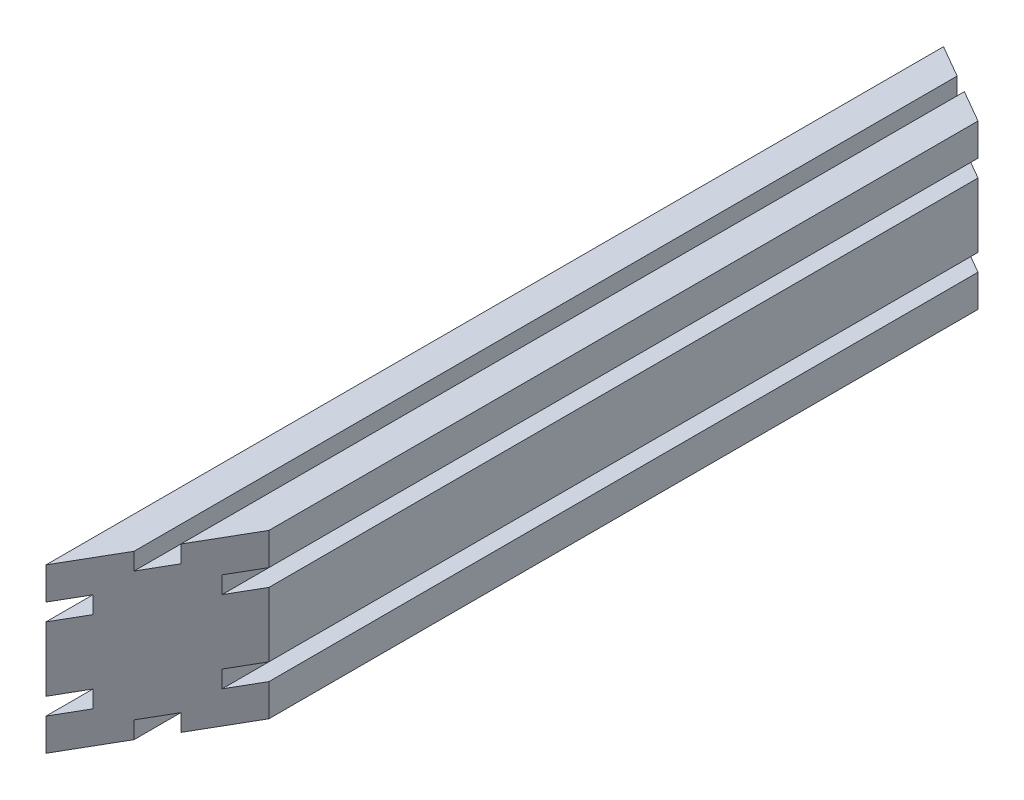
ISO-10303-21;
HEADER;
FILE_DESCRIPTION(('STEP AP214'),'2;1');
FILE_NAME('part.step','',(''),(''),'','','');
FILE_SCHEMA(('AUTOMOTIVE_DESIGN { 1 0 10303 214 1 1 1 1 }'));
ENDSEC;
DATA;
#1=APPLICATION_CONTEXT('core data for automotive mechanical design processes');
#2=APPLICATION_PROTOCOL_DEFINITION('international standard','automotive_design',2000,#1);
#3=PRODUCT_CONTEXT('',#1,'mechanical');
#4=PRODUCT('Part','Part','',(#3));
#5=PRODUCT_RELATED_PRODUCT_CATEGORY('part','',(#4));
#6=PRODUCT_DEFINITION_FORMATION('','',#4);
#7=PRODUCT_DEFINITION_CONTEXT('part definition',#1,'design');
#8=PRODUCT_DEFINITION('design','',#6,#7);
#9=PRODUCT_DEFINITION_SHAPE('','',#8);
#10=(LENGTH_UNIT() NAMED_UNIT(*) SI_UNIT(.MILLI.,.METRE.));
#11=(NAMED_UNIT(*) PLANE_ANGLE_UNIT() SI_UNIT($,.RADIAN.));
#12=(NAMED_UNIT(*) SI_UNIT($,.STERADIAN.) SOLID_ANGLE_UNIT());
#13=UNCERTAINTY_MEASURE_WITH_UNIT(LENGTH_MEASURE(1.E-05),#10,'distance_accuracy_value','');
#14=(GEOMETRIC_REPRESENTATION_CONTEXT(3) GLOBAL_UNCERTAINTY_ASSIGNED_CONTEXT((#13)) GLOBAL_UNIT_ASSIGNED_CONTEXT((#10,
#11,#12)) REPRESENTATION_CONTEXT('',''));
#15=CARTESIAN_POINT('',(0.,0.,0.));
#16=DIRECTION('',(0.,0.,1.));
#17=DIRECTION('',(1.,0.,0.));
#18=AXIS2_PLACEMENT_3D('',#15,#16,#17);
#19=CARTESIAN_POINT('',(-19.05,-23.05,419.1));
#20=DIRECTION('',(1.,0.,0.));
#21=DIRECTION('',(0.,0.,-1.));
#22=AXIS2_PLACEMENT_3D('',#19,#20,#21);
#23=PLANE('',#22);
#24=DIRECTION('',(0.,-1.,0.));
#25=VECTOR('',#24,1.);
#26=CARTESIAN_POINT('',(-19.05,-23.05,0.));
#27=LINE('',#26,#25);
#28=CARTESIAN_POINT('',(-19.05,-23.05,0.));
#29=VERTEX_POINT('',#28);
#30=CARTESIAN_POINT('',(-19.05,-38.1,0.));
#31=VERTEX_POINT('',#30);
#32=EDGE_CURVE('E230',#29,#31,#27,.T.);
#33=ORIENTED_EDGE('',*,*,#32,.T.);
#34=DIRECTION('',(0.,0.,-1.));
#35=VECTOR('',#34,1.);
#36=CARTESIAN_POINT('',(-19.05,-38.1,419.1));
#37=LINE('',#36,#35);
#38=CARTESIAN_POINT('',(-19.05,-38.1,419.1));
#39=VERTEX_POINT('',#38);
#40=EDGE_CURVE('E11',#39,#31,#37,.T.);
#41=ORIENTED_EDGE('',*,*,#40,.F.);
#42=DIRECTION('',(0.,-1.,0.));
#43=VECTOR('',#42,1.);
#44=CARTESIAN_POINT('',(-19.05,-23.05,419.1));
#45=LINE('',#44,#43);
#46=CARTESIAN_POINT('',(-19.05,-23.05,419.1));
#47=VERTEX_POINT('',#46);
#48=EDGE_CURVE('E442',#47,#39,#45,.T.);
#49=ORIENTED_EDGE('',*,*,#48,.F.);
#50=DIRECTION('',(0.,0.,-1.));
#51=VECTOR('',#50,1.);
#52=CARTESIAN_POINT('',(-19.05,-23.05,419.1));
#53=LINE('',#52,#51);
#54=EDGE_CURVE('E447',#47,#29,#53,.T.);
#55=ORIENTED_EDGE('',*,*,#54,.T.);
#56=EDGE_LOOP('',(#33,#41,#49,#55));
#57=FACE_BOUND('',#56,.T.);
#58=ADVANCED_FACE('F39',(#57),#23,.F.);
#59=CARTESIAN_POINT('',(-19.05,-38.1,419.1));
#60=DIRECTION('',(0.,1.,0.));
#61=DIRECTION('',(0.,0.,1.));
#62=AXIS2_PLACEMENT_3D('',#59,#60,#61);
#63=PLANE('',#62);
#64=ORIENTED_EDGE('',*,*,#40,.T.);
#65=DIRECTION('',(0.866044807861594,0.,0.499966389646319));
#66=VECTOR('',#65,1.);
#67=CARTESIAN_POINT('',(25.,-38.1,25.43));
#68=LINE('',#67,#66);
#69=CARTESIAN_POINT('',(-4.00000000000001,-38.1,8.68834279228149));
#70=VERTEX_POINT('',#69);
#71=EDGE_CURVE('E315',#31,#70,#68,.T.);
#72=ORIENTED_EDGE('',*,*,#71,.T.);
#73=DIRECTION('',(0.,0.,-1.));
#74=VECTOR('',#73,1.);
#75=CARTESIAN_POINT('',(-4.,-38.1,419.1));
#76=LINE('',#75,#74);
#77=CARTESIAN_POINT('',(-4.,-38.1,393.031555051078));
#78=VERTEX_POINT('',#77);
#79=EDGE_CURVE('E47',#78,#70,#76,.T.);
#80=ORIENTED_EDGE('',*,*,#79,.F.);
#81=DIRECTION('',(-0.499984459490195,0.,0.866034375916047));
#82=VECTOR('',#81,1.);
#83=CARTESIAN_POINT('',(-19.05,-38.1,419.1));
#84=LINE('',#83,#82);
#85=EDGE_CURVE('E313',#78,#39,#84,.T.);
#86=ORIENTED_EDGE('',*,*,#85,.T.);
#87=EDGE_LOOP('',(#64,#72,#80,#86));
#88=FACE_BOUND('',#87,.T.);
#89=ADVANCED_FACE('F312',(#88),#63,.F.);
#90=CARTESIAN_POINT('',(-4.,-38.1,419.1));
#91=DIRECTION('',(-1.,0.,0.));
#92=DIRECTION('',(0.,0.,1.));
#93=AXIS2_PLACEMENT_3D('',#90,#91,#92);
#94=PLANE('',#93);
#95=ORIENTED_EDGE('',*,*,#79,.T.);
#96=DIRECTION('',(0.,1.,0.));
#97=VECTOR('',#96,1.);
#98=CARTESIAN_POINT('',(-4.,-38.1,8.68834279228148));
#99=LINE('',#98,#97);
#100=CARTESIAN_POINT('',(-4.,-30.1,8.68834279228149));
#101=VERTEX_POINT('',#100);
#102=EDGE_CURVE('E307',#70,#101,#99,.T.);
#103=ORIENTED_EDGE('',*,*,#102,.T.);
#104=DIRECTION('',(0.,0.,-1.));
#105=VECTOR('',#104,1.);
#106=CARTESIAN_POINT('',(-4.,-30.1,419.1));
#107=LINE('',#106,#105);
#108=CARTESIAN_POINT('',(-4.,-30.1,393.031555051078));
#109=VERTEX_POINT('',#108);
#110=EDGE_CURVE('E298',#109,#101,#107,.T.);
#111=ORIENTED_EDGE('',*,*,#110,.F.);
#112=DIRECTION('',(0.,-1.,0.));
#113=VECTOR('',#112,1.);
#114=CARTESIAN_POINT('',(-4.,-38.1,393.031555051078));
#115=LINE('',#114,#113);
#116=EDGE_CURVE('E308',#109,#78,#115,.T.);
#117=ORIENTED_EDGE('',*,*,#116,.T.);
#118=EDGE_LOOP('',(#95,#103,#111,#117));
#119=FACE_BOUND('',#118,.T.);
#120=ADVANCED_FACE('F305',(#119),#94,.F.);
#121=CARTESIAN_POINT('',(-4.,-30.1,419.1));
#122=DIRECTION('',(0.,1.,0.));
#123=DIRECTION('',(0.,0.,1.));
#124=AXIS2_PLACEMENT_3D('',#121,#122,#123);
#125=PLANE('',#124);
#126=ORIENTED_EDGE('',*,*,#110,.T.);
#127=DIRECTION('',(0.866044807861594,0.,0.499966389646319));
#128=VECTOR('',#127,1.);
#129=CARTESIAN_POINT('',(173.705496113119,-30.1,111.277463476881));
#130=LINE('',#129,#128);
#131=CARTESIAN_POINT('',(4.,-30.1,13.3067309875142));
#132=VERTEX_POINT('',#131);
#133=EDGE_CURVE('E374',#101,#132,#130,.T.);
#134=ORIENTED_EDGE('',*,*,#133,.T.);
#135=DIRECTION('',(0.,0.,-1.));
#136=VECTOR('',#135,1.);
#137=CARTESIAN_POINT('',(4.,-30.1,419.1));
#138=LINE('',#137,#136);
#139=CARTESIAN_POINT('',(4.,-30.1,379.174574347333));
#140=VERTEX_POINT('',#139);
#141=EDGE_CURVE('E295',#140,#132,#138,.T.);
#142=ORIENTED_EDGE('',*,*,#141,.F.);
#143=DIRECTION('',(-0.499984459490195,0.,0.866034375916047));
#144=VECTOR('',#143,1.);
#145=CARTESIAN_POINT('',(-15.2877338810379,-30.1,412.583293873398));
#146=LINE('',#145,#144);
#147=EDGE_CURVE('E438',#140,#109,#146,.T.);
#148=ORIENTED_EDGE('',*,*,#147,.T.);
#149=EDGE_LOOP('',(#126,#134,#142,#148));
#150=FACE_BOUND('',#149,.T.);
#151=ADVANCED_FACE('F524',(#150),#125,.F.);
#152=CARTESIAN_POINT('',(4.,-30.1,419.1));
#153=DIRECTION('',(1.,0.,0.));
#154=DIRECTION('',(0.,0.,-1.));
#155=AXIS2_PLACEMENT_3D('',#152,#153,#154);
#156=PLANE('',#155);
#157=ORIENTED_EDGE('',*,*,#141,.T.);
#158=DIRECTION('',(0.,-1.,0.));
#159=VECTOR('',#158,1.);
#160=CARTESIAN_POINT('',(4.,-30.1,13.3067309875142));
#161=LINE('',#160,#159);
#162=CARTESIAN_POINT('',(4.00000000000002,-38.1,13.3067309875142));
#163=VERTEX_POINT('',#162);
#164=EDGE_CURVE('E371',#132,#163,#161,.T.);
#165=ORIENTED_EDGE('',*,*,#164,.T.);
#166=DIRECTION('',(0.,0.,-1.));
#167=VECTOR('',#166,1.);
#168=CARTESIAN_POINT('',(4.,-38.1,419.1));
#169=LINE('',#168,#167);
#170=CARTESIAN_POINT('',(3.99999999999999,-38.1,379.174574347333));
#171=VERTEX_POINT('',#170);
#172=EDGE_CURVE('E292',#171,#163,#169,.T.);
#173=ORIENTED_EDGE('',*,*,#172,.F.);
#174=DIRECTION('',(0.,1.,0.));
#175=VECTOR('',#174,1.);
#176=CARTESIAN_POINT('',(4.,-30.1,379.174574347333));
#177=LINE('',#176,#175);
#178=EDGE_CURVE('E435',#171,#140,#177,.T.);
#179=ORIENTED_EDGE('',*,*,#178,.T.);
#180=EDGE_LOOP('',(#157,#165,#173,#179));
#181=FACE_BOUND('',#180,.T.);
#182=ADVANCED_FACE('F521',(#181),#156,.F.);
#183=CARTESIAN_POINT('',(4.,-38.1,419.1));
#184=DIRECTION('',(0.,1.,0.));
#185=DIRECTION('',(0.,0.,1.));
#186=AXIS2_PLACEMENT_3D('',#183,#184,#185);
#187=PLANE('',#186);
#188=ORIENTED_EDGE('',*,*,#172,.T.);
#189=CARTESIAN_POINT('',(19.05,-38.1,21.9950737797957));
#190=VERTEX_POINT('',#189);
#191=EDGE_CURVE('E241',#163,#190,#68,.T.);
#192=ORIENTED_EDGE('',*,*,#191,.T.);
#193=DIRECTION('',(0.,0.,-1.));
#194=VECTOR('',#193,1.);
#195=CARTESIAN_POINT('',(19.05,-38.1,419.1));
#196=LINE('',#195,#194);
#197=CARTESIAN_POINT('',(19.05,-38.1,353.106129398411));
#198=VERTEX_POINT('',#197);
#199=EDGE_CURVE('E289',#198,#190,#196,.T.);
#200=ORIENTED_EDGE('',*,*,#199,.F.);
#201=EDGE_CURVE('E382',#198,#171,#84,.T.);
#202=ORIENTED_EDGE('',*,*,#201,.T.);
#203=EDGE_LOOP('',(#188,#192,#200,#202));
#204=FACE_BOUND('',#203,.T.);
#205=ADVANCED_FACE('F517',(#204),#187,.F.);
#206=CARTESIAN_POINT('',(19.05,-38.1,419.1));
#207=DIRECTION('',(-1.,0.,0.));
#208=DIRECTION('',(0.,0.,1.));
#209=AXIS2_PLACEMENT_3D('',#206,#207,#208);
#210=PLANE('',#209);
#211=ORIENTED_EDGE('',*,*,#199,.T.);
#212=DIRECTION('',(0.,1.,0.));
#213=VECTOR('',#212,1.);
#214=CARTESIAN_POINT('',(19.05,-38.1,21.9950737797956));
#215=LINE('',#214,#213);
#216=CARTESIAN_POINT('',(19.05,-23.05,21.9950737797957));
#217=VERTEX_POINT('',#216);
#218=EDGE_CURVE('E368',#190,#217,#215,.T.);
#219=ORIENTED_EDGE('',*,*,#218,.T.);
#220=DIRECTION('',(0.,0.,-1.));
#221=VECTOR('',#220,1.);
#222=CARTESIAN_POINT('',(19.05,-23.05,419.1));
#223=LINE('',#222,#221);
#224=CARTESIAN_POINT('',(19.05,-23.05,353.106129398411));
#225=VERTEX_POINT('',#224);
#226=EDGE_CURVE('E286',#225,#217,#223,.T.);
#227=ORIENTED_EDGE('',*,*,#226,.F.);
#228=DIRECTION('',(0.,-1.,0.));
#229=VECTOR('',#228,1.);
#230=CARTESIAN_POINT('',(19.05,-38.1,353.106129398411));
#231=LINE('',#230,#229);
#232=EDGE_CURVE('E432',#225,#198,#231,.T.);
#233=ORIENTED_EDGE('',*,*,#232,.T.);
#234=EDGE_LOOP('',(#211,#219,#227,#233));
#235=FACE_BOUND('',#234,.T.);
#236=ADVANCED_FACE('F514',(#235),#210,.F.);
#237=CARTESIAN_POINT('',(19.05,-23.05,419.1));
#238=DIRECTION('',(0.,-1.,0.));
#239=DIRECTION('',(0.,0.,-1.));
#240=AXIS2_PLACEMENT_3D('',#237,#238,#239);
#241=PLANE('',#240);
#242=ORIENTED_EDGE('',*,*,#226,.T.);
#243=DIRECTION('',(-0.866044807861594,0.,-0.499966389646319));
#244=VECTOR('',#243,1.);
#245=CARTESIAN_POINT('',(190.993770805733,-23.05,121.25795894642));
#246=LINE('',#245,#244);
#247=CARTESIAN_POINT('',(11.05,-23.05,17.376685584563));
#248=VERTEX_POINT('',#247);
#249=EDGE_CURVE('E365',#217,#248,#246,.T.);
#250=ORIENTED_EDGE('',*,*,#249,.T.);
#251=DIRECTION('',(0.,0.,-1.));
#252=VECTOR('',#251,1.);
#253=CARTESIAN_POINT('',(11.05,-23.05,419.1));
#254=LINE('',#253,#252);
#255=CARTESIAN_POINT('',(11.05,-23.05,366.963110102157));
#256=VERTEX_POINT('',#255);
#257=EDGE_CURVE('E283',#256,#248,#254,.T.);
#258=ORIENTED_EDGE('',*,*,#257,.F.);
#259=DIRECTION('',(0.499984459490195,0.,-0.866034375916047));
#260=VECTOR('',#259,1.);
#261=CARTESIAN_POINT('',(-9.52559208422214,-23.05,402.602557912058));
#262=LINE('',#261,#260);
#263=EDGE_CURVE('E429',#256,#225,#262,.T.);
#264=ORIENTED_EDGE('',*,*,#263,.T.);
#265=EDGE_LOOP('',(#242,#250,#258,#264));
#266=FACE_BOUND('',#265,.T.);
#267=ADVANCED_FACE('F511',(#266),#241,.F.);
#268=CARTESIAN_POINT('',(11.05,-23.05,419.1));
#269=DIRECTION('',(-1.,0.,0.));
#270=DIRECTION('',(0.,0.,1.));
#271=AXIS2_PLACEMENT_3D('',#268,#269,#270);
#272=PLANE('',#271);
#273=ORIENTED_EDGE('',*,*,#257,.T.);
#274=DIRECTION('',(0.,1.,0.));
#275=VECTOR('',#274,1.);
#276=CARTESIAN_POINT('',(11.05,-23.05,17.376685584563));
#277=LINE('',#276,#275);
#278=CARTESIAN_POINT('',(11.05,-15.05,17.376685584563));
#279=VERTEX_POINT('',#278);
#280=EDGE_CURVE('E362',#248,#279,#277,.T.);
#281=ORIENTED_EDGE('',*,*,#280,.T.);
#282=DIRECTION('',(0.,0.,-1.));
#283=VECTOR('',#282,1.);
#284=CARTESIAN_POINT('',(11.05,-15.05,419.1));
#285=LINE('',#284,#283);
#286=CARTESIAN_POINT('',(11.05,-15.05,366.963110102157));
#287=VERTEX_POINT('',#286);
#288=EDGE_CURVE('E280',#287,#279,#285,.T.);
#289=ORIENTED_EDGE('',*,*,#288,.F.);
#290=DIRECTION('',(0.,-1.,0.));
#291=VECTOR('',#290,1.);
#292=CARTESIAN_POINT('',(11.05,-23.05,366.963110102157));
#293=LINE('',#292,#291);
#294=EDGE_CURVE('E426',#287,#256,#293,.T.);
#295=ORIENTED_EDGE('',*,*,#294,.T.);
#296=EDGE_LOOP('',(#273,#281,#289,#295));
#297=FACE_BOUND('',#296,.T.);
#298=ADVANCED_FACE('F508',(#297),#272,.F.);
#299=CARTESIAN_POINT('',(11.05,-15.05,419.1));
#300=DIRECTION('',(0.,1.,0.));
#301=DIRECTION('',(0.,0.,1.));
#302=AXIS2_PLACEMENT_3D('',#299,#300,#301);
#303=PLANE('',#302);
#304=ORIENTED_EDGE('',*,*,#288,.T.);
#305=DIRECTION('',(0.866044807861594,0.,0.499966389646319));
#306=VECTOR('',#305,1.);
#307=CARTESIAN_POINT('',(184.993501931941,-15.05,117.794012579552));
#308=LINE('',#307,#306);
#309=CARTESIAN_POINT('',(19.05,-15.05,21.9950737797956));
#310=VERTEX_POINT('',#309);
#311=EDGE_CURVE('E359',#279,#310,#308,.T.);
#312=ORIENTED_EDGE('',*,*,#311,.T.);
#313=DIRECTION('',(0.,0.,-1.));
#314=VECTOR('',#313,1.);
#315=CARTESIAN_POINT('',(19.05,-15.05,419.1));
#316=LINE('',#315,#314);
#317=CARTESIAN_POINT('',(19.05,-15.05,353.106129398411));
#318=VERTEX_POINT('',#317);
#319=EDGE_CURVE('E277',#318,#310,#316,.T.);
#320=ORIENTED_EDGE('',*,*,#319,.F.);
#321=DIRECTION('',(-0.499984459490195,0.,0.866034375916047));
#322=VECTOR('',#321,1.);
#323=CARTESIAN_POINT('',(-11.5254677620758,-15.05,406.066587746796));
#324=LINE('',#323,#322);
#325=EDGE_CURVE('E423',#318,#287,#324,.T.);
#326=ORIENTED_EDGE('',*,*,#325,.T.);
#327=EDGE_LOOP('',(#304,#312,#320,#326));
#328=FACE_BOUND('',#327,.T.);
#329=ADVANCED_FACE('F505',(#328),#303,.F.);
#330=CARTESIAN_POINT('',(19.05,-15.05,419.1));
#331=DIRECTION('',(-1.,0.,0.));
#332=DIRECTION('',(0.,0.,1.));
#333=AXIS2_PLACEMENT_3D('',#330,#331,#332);
#334=PLANE('',#333);
#335=ORIENTED_EDGE('',*,*,#319,.T.);
#336=DIRECTION('',(0.,1.,0.));
#337=VECTOR('',#336,1.);
#338=CARTESIAN_POINT('',(19.05,-15.05,21.9950737797956));
#339=LINE('',#338,#337);
#340=CARTESIAN_POINT('',(19.05,15.05,21.9950737797957));
#341=VERTEX_POINT('',#340);
#342=EDGE_CURVE('E356',#310,#341,#339,.T.);
#343=ORIENTED_EDGE('',*,*,#342,.T.);
#344=DIRECTION('',(0.,0.,-1.));
#345=VECTOR('',#344,1.);
#346=CARTESIAN_POINT('',(19.05,15.05,419.1));
#347=LINE('',#346,#345);
#348=CARTESIAN_POINT('',(19.05,15.05,353.106129398411));
#349=VERTEX_POINT('',#348);
#350=EDGE_CURVE('E274',#349,#341,#347,.T.);
#351=ORIENTED_EDGE('',*,*,#350,.F.);
#352=DIRECTION('',(0.,-1.,0.));
#353=VECTOR('',#352,1.);
#354=CARTESIAN_POINT('',(19.05,-15.05,353.106129398411));
#355=LINE('',#354,#353);
#356=EDGE_CURVE('E420',#349,#318,#355,.T.);
#357=ORIENTED_EDGE('',*,*,#356,.T.);
#358=EDGE_LOOP('',(#335,#343,#351,#357));
#359=FACE_BOUND('',#358,.T.);
#360=ADVANCED_FACE('F502',(#359),#334,.F.);
#361=CARTESIAN_POINT('',(19.05,15.05,419.1));
#362=DIRECTION('',(0.,-1.,0.));
#363=DIRECTION('',(0.,0.,-1.));
#364=AXIS2_PLACEMENT_3D('',#361,#362,#363);
#365=PLANE('',#364);
#366=ORIENTED_EDGE('',*,*,#350,.T.);
#367=DIRECTION('',(-0.866044807861594,0.,-0.499966389646319));
#368=VECTOR('',#367,1.);
#369=CARTESIAN_POINT('',(190.993770805733,15.05,121.25795894642));
#370=LINE('',#369,#368);
#371=CARTESIAN_POINT('',(11.05,15.05,17.376685584563));
#372=VERTEX_POINT('',#371);
#373=EDGE_CURVE('E353',#341,#372,#370,.T.);
#374=ORIENTED_EDGE('',*,*,#373,.T.);
#375=DIRECTION('',(0.,0.,-1.));
#376=VECTOR('',#375,1.);
#377=CARTESIAN_POINT('',(11.05,15.05,419.1));
#378=LINE('',#377,#376);
#379=CARTESIAN_POINT('',(11.05,15.05,366.963110102157));
#380=VERTEX_POINT('',#379);
#381=EDGE_CURVE('E271',#380,#372,#378,.T.);
#382=ORIENTED_EDGE('',*,*,#381,.F.);
#383=DIRECTION('',(0.499984459490195,0.,-0.866034375916047));
#384=VECTOR('',#383,1.);
#385=CARTESIAN_POINT('',(-9.52559208422214,15.05,402.602557912058));
#386=LINE('',#385,#384);
#387=EDGE_CURVE('E417',#380,#349,#386,.T.);
#388=ORIENTED_EDGE('',*,*,#387,.T.);
#389=EDGE_LOOP('',(#366,#374,#382,#388));
#390=FACE_BOUND('',#389,.T.);
#391=ADVANCED_FACE('F499',(#390),#365,.F.);
#392=CARTESIAN_POINT('',(11.05,15.05,419.1));
#393=DIRECTION('',(-1.,0.,0.));
#394=DIRECTION('',(0.,0.,1.));
#395=AXIS2_PLACEMENT_3D('',#392,#393,#394);
#396=PLANE('',#395);
#397=ORIENTED_EDGE('',*,*,#381,.T.);
#398=DIRECTION('',(0.,1.,0.));
#399=VECTOR('',#398,1.);
#400=CARTESIAN_POINT('',(11.05,15.05,17.376685584563));
#401=LINE('',#400,#399);
#402=CARTESIAN_POINT('',(11.05,23.05,17.376685584563));
#403=VERTEX_POINT('',#402);
#404=EDGE_CURVE('E350',#372,#403,#401,.T.);
#405=ORIENTED_EDGE('',*,*,#404,.T.);
#406=DIRECTION('',(0.,0.,-1.));
#407=VECTOR('',#406,1.);
#408=CARTESIAN_POINT('',(11.05,23.05,419.1));
#409=LINE('',#408,#407);
#410=CARTESIAN_POINT('',(11.05,23.05,366.963110102157));
#411=VERTEX_POINT('',#410);
#412=EDGE_CURVE('E268',#411,#403,#409,.T.);
#413=ORIENTED_EDGE('',*,*,#412,.F.);
#414=DIRECTION('',(0.,-1.,0.));
#415=VECTOR('',#414,1.);
#416=CARTESIAN_POINT('',(11.05,15.05,366.963110102157));
#417=LINE('',#416,#415);
#418=EDGE_CURVE('E414',#411,#380,#417,.T.);
#419=ORIENTED_EDGE('',*,*,#418,.T.);
#420=EDGE_LOOP('',(#397,#405,#413,#419));
#421=FACE_BOUND('',#420,.T.);
#422=ADVANCED_FACE('F496',(#421),#396,.F.);
#423=CARTESIAN_POINT('',(11.05,23.05,419.1));
#424=DIRECTION('',(0.,1.,0.));
#425=DIRECTION('',(0.,0.,1.));
#426=AXIS2_PLACEMENT_3D('',#423,#424,#425);
#427=PLANE('',#426);
#428=ORIENTED_EDGE('',*,*,#412,.T.);
#429=DIRECTION('',(0.866044807861594,0.,0.499966389646319));
#430=VECTOR('',#429,1.);
#431=CARTESIAN_POINT('',(184.993501931941,23.05,117.794012579552));
#432=LINE('',#431,#430);
#433=CARTESIAN_POINT('',(19.05,23.05,21.9950737797956));
#434=VERTEX_POINT('',#433);
#435=EDGE_CURVE('E347',#403,#434,#432,.T.);
#436=ORIENTED_EDGE('',*,*,#435,.T.);
#437=DIRECTION('',(0.,0.,-1.));
#438=VECTOR('',#437,1.);
#439=CARTESIAN_POINT('',(19.05,23.05,419.1));
#440=LINE('',#439,#438);
#441=CARTESIAN_POINT('',(19.05,23.05,353.106129398411));
#442=VERTEX_POINT('',#441);
#443=EDGE_CURVE('E265',#442,#434,#440,.T.);
#444=ORIENTED_EDGE('',*,*,#443,.F.);
#445=DIRECTION('',(-0.499984459490195,0.,0.866034375916047));
#446=VECTOR('',#445,1.);
#447=CARTESIAN_POINT('',(-11.5254677620758,23.05,406.066587746796));
#448=LINE('',#447,#446);
#449=EDGE_CURVE('E411',#442,#411,#448,.T.);
#450=ORIENTED_EDGE('',*,*,#449,.T.);
#451=EDGE_LOOP('',(#428,#436,#444,#450));
#452=FACE_BOUND('',#451,.T.);
#453=ADVANCED_FACE('F493',(#452),#427,.F.);
#454=CARTESIAN_POINT('',(19.05,23.05,419.1));
#455=DIRECTION('',(-1.,0.,0.));
#456=DIRECTION('',(0.,0.,1.));
#457=AXIS2_PLACEMENT_3D('',#454,#455,#456);
#458=PLANE('',#457);
#459=ORIENTED_EDGE('',*,*,#443,.T.);
#460=DIRECTION('',(0.,1.,0.));
#461=VECTOR('',#460,1.);
#462=CARTESIAN_POINT('',(19.05,23.05,21.9950737797956));
#463=LINE('',#462,#461);
#464=CARTESIAN_POINT('',(19.05,38.1,21.9950737797957));
#465=VERTEX_POINT('',#464);
#466=EDGE_CURVE('E344',#434,#465,#463,.T.);
#467=ORIENTED_EDGE('',*,*,#466,.T.);
#468=DIRECTION('',(0.,0.,-1.));
#469=VECTOR('',#468,1.);
#470=CARTESIAN_POINT('',(19.05,38.1,419.1));
#471=LINE('',#470,#469);
#472=CARTESIAN_POINT('',(19.05,38.1,353.106129398411));
#473=VERTEX_POINT('',#472);
#474=EDGE_CURVE('E262',#473,#465,#471,.T.);
#475=ORIENTED_EDGE('',*,*,#474,.F.);
#476=DIRECTION('',(0.,-1.,0.));
#477=VECTOR('',#476,1.);
#478=CARTESIAN_POINT('',(19.05,23.05,353.106129398411));
#479=LINE('',#478,#477);
#480=EDGE_CURVE('E408',#473,#442,#479,.T.);
#481=ORIENTED_EDGE('',*,*,#480,.T.);
#482=EDGE_LOOP('',(#459,#467,#475,#481));
#483=FACE_BOUND('',#482,.T.);
#484=ADVANCED_FACE('F490',(#483),#458,.F.);
#485=CARTESIAN_POINT('',(19.05,38.1,419.1));
#486=DIRECTION('',(0.,-1.,0.));
#487=DIRECTION('',(0.,0.,-1.));
#488=AXIS2_PLACEMENT_3D('',#485,#486,#487);
#489=PLANE('',#488);
#490=ORIENTED_EDGE('',*,*,#474,.T.);
#491=DIRECTION('',(0.866044807861594,0.,0.499966389646319));
#492=VECTOR('',#491,1.);
#493=CARTESIAN_POINT('',(25.,38.1,25.43));
#494=LINE('',#493,#492);
#495=CARTESIAN_POINT('',(3.99999999999999,38.1,13.3067309875142));
#496=VERTEX_POINT('',#495);
#497=EDGE_CURVE('E242',#496,#465,#494,.T.);
#498=ORIENTED_EDGE('',*,*,#497,.F.);
#499=DIRECTION('',(0.,0.,-1.));
#500=VECTOR('',#499,1.);
#501=CARTESIAN_POINT('',(4.,38.1,419.1));
#502=LINE('',#501,#500);
#503=CARTESIAN_POINT('',(4.,38.1,379.174574347333));
#504=VERTEX_POINT('',#503);
#505=EDGE_CURVE('E259',#504,#496,#502,.T.);
#506=ORIENTED_EDGE('',*,*,#505,.F.);
#507=DIRECTION('',(-0.499984459490195,0.,0.866034375916047));
#508=VECTOR('',#507,1.);
#509=CARTESIAN_POINT('',(-19.05,38.1,419.1));
#510=LINE('',#509,#508);
#511=EDGE_CURVE('E380',#473,#504,#510,.T.);
#512=ORIENTED_EDGE('',*,*,#511,.F.);
#513=EDGE_LOOP('',(#490,#498,#506,#512));
#514=FACE_BOUND('',#513,.T.);
#515=ADVANCED_FACE('F486',(#514),#489,.F.);
#516=CARTESIAN_POINT('',(4.,38.1,419.1));
#517=DIRECTION('',(1.,0.,0.));
#518=DIRECTION('',(0.,0.,-1.));
#519=AXIS2_PLACEMENT_3D('',#516,#517,#518);
#520=PLANE('',#519);
#521=ORIENTED_EDGE('',*,*,#505,.T.);
#522=DIRECTION('',(0.,-1.,0.));
#523=VECTOR('',#522,1.);
#524=CARTESIAN_POINT('',(4.,38.1,13.3067309875142));
#525=LINE('',#524,#523);
#526=CARTESIAN_POINT('',(4.,30.1,13.3067309875142));
#527=VERTEX_POINT('',#526);
#528=EDGE_CURVE('E341',#496,#527,#525,.T.);
#529=ORIENTED_EDGE('',*,*,#528,.T.);
#530=DIRECTION('',(0.,0.,-1.));
#531=VECTOR('',#530,1.);
#532=CARTESIAN_POINT('',(4.,30.1,419.1));
#533=LINE('',#532,#531);
#534=CARTESIAN_POINT('',(4.,30.1,379.174574347333));
#535=VERTEX_POINT('',#534);
#536=EDGE_CURVE('E256',#535,#527,#533,.T.);
#537=ORIENTED_EDGE('',*,*,#536,.F.);
#538=DIRECTION('',(0.,1.,0.));
#539=VECTOR('',#538,1.);
#540=CARTESIAN_POINT('',(4.,38.1,379.174574347333));
#541=LINE('',#540,#539);
#542=EDGE_CURVE('E405',#535,#504,#541,.T.);
#543=ORIENTED_EDGE('',*,*,#542,.T.);
#544=EDGE_LOOP('',(#521,#529,#537,#543));
#545=FACE_BOUND('',#544,.T.);
#546=ADVANCED_FACE('F482',(#545),#520,.F.);
#547=CARTESIAN_POINT('',(4.,30.1,419.1));
#548=DIRECTION('',(0.,-1.,0.));
#549=DIRECTION('',(0.,0.,-1.));
#550=AXIS2_PLACEMENT_3D('',#547,#548,#549);
#551=PLANE('',#550);
#552=ORIENTED_EDGE('',*,*,#536,.T.);
#553=DIRECTION('',(-0.866044807861594,0.,-0.499966389646319));
#554=VECTOR('',#553,1.);
#555=CARTESIAN_POINT('',(179.705764986912,30.1,114.741409843749));
#556=LINE('',#555,#554);
#557=CARTESIAN_POINT('',(-4.,30.1,8.68834279228148));
#558=VERTEX_POINT('',#557);
#559=EDGE_CURVE('E338',#527,#558,#556,.T.);
#560=ORIENTED_EDGE('',*,*,#559,.T.);
#561=DIRECTION('',(0.,0.,-1.));
#562=VECTOR('',#561,1.);
#563=CARTESIAN_POINT('',(-4.,30.1,419.1));
#564=LINE('',#563,#562);
#565=CARTESIAN_POINT('',(-4.,30.1,393.031555051078));
#566=VERTEX_POINT('',#565);
#567=EDGE_CURVE('E248',#566,#558,#564,.T.);
#568=ORIENTED_EDGE('',*,*,#567,.F.);
#569=DIRECTION('',(0.499984459490195,0.,-0.866034375916047));
#570=VECTOR('',#569,1.);
#571=CARTESIAN_POINT('',(-13.2878582031843,30.1,409.11926403866));
#572=LINE('',#571,#570);
#573=EDGE_CURVE('E402',#566,#535,#572,.T.);
#574=ORIENTED_EDGE('',*,*,#573,.T.);
#575=EDGE_LOOP('',(#552,#560,#568,#574));
#576=FACE_BOUND('',#575,.T.);
#577=ADVANCED_FACE('F479',(#576),#551,.F.);
#578=CARTESIAN_POINT('',(-4.,30.1,419.1));
#579=DIRECTION('',(-1.,0.,0.));
#580=DIRECTION('',(0.,0.,1.));
#581=AXIS2_PLACEMENT_3D('',#578,#579,#580);
#582=PLANE('',#581);
#583=ORIENTED_EDGE('',*,*,#567,.T.);
#584=DIRECTION('',(0.,1.,0.));
#585=VECTOR('',#584,1.);
#586=CARTESIAN_POINT('',(-4.,30.1,8.68834279228148));
#587=LINE('',#586,#585);
#588=CARTESIAN_POINT('',(-4.00000000000001,38.1,8.6883427922815));
#589=VERTEX_POINT('',#588);
#590=EDGE_CURVE('E336',#558,#589,#587,.T.);
#591=ORIENTED_EDGE('',*,*,#590,.T.);
#592=DIRECTION('',(0.,0.,-1.));
#593=VECTOR('',#592,1.);
#594=CARTESIAN_POINT('',(-4.,38.1,419.1));
#595=LINE('',#594,#593);
#596=CARTESIAN_POINT('',(-4.00000000000001,38.1,393.031555051078));
#597=VERTEX_POINT('',#596);
#598=EDGE_CURVE('E240',#597,#589,#595,.T.);
#599=ORIENTED_EDGE('',*,*,#598,.F.);
#600=DIRECTION('',(0.,-1.,0.));
#601=VECTOR('',#600,1.);
#602=CARTESIAN_POINT('',(-4.,30.1,393.031555051078));
#603=LINE('',#602,#601);
#604=EDGE_CURVE('E399',#597,#566,#603,.T.);
#605=ORIENTED_EDGE('',*,*,#604,.T.);
#606=EDGE_LOOP('',(#583,#591,#599,#605));
#607=FACE_BOUND('',#606,.T.);
#608=ADVANCED_FACE('F476',(#607),#582,.F.);
#609=CARTESIAN_POINT('',(-4.,38.1,419.1));
#610=DIRECTION('',(0.,-1.,0.));
#611=DIRECTION('',(0.,0.,-1.));
#612=AXIS2_PLACEMENT_3D('',#609,#610,#611);
#613=PLANE('',#612);
#614=ORIENTED_EDGE('',*,*,#598,.T.);
#615=CARTESIAN_POINT('',(-19.05,38.1,0.));
#616=VERTEX_POINT('',#615);
#617=EDGE_CURVE('E221',#616,#589,#494,.T.);
#618=ORIENTED_EDGE('',*,*,#617,.F.);
#619=DIRECTION('',(0.,0.,-1.));
#620=VECTOR('',#619,1.);
#621=CARTESIAN_POINT('',(-19.05,38.1,419.1));
#622=LINE('',#621,#620);
#623=CARTESIAN_POINT('',(-19.05,38.1,419.1));
#624=VERTEX_POINT('',#623);
#625=EDGE_CURVE('E237',#624,#616,#622,.T.);
#626=ORIENTED_EDGE('',*,*,#625,.F.);
#627=EDGE_CURVE('E378',#597,#624,#510,.T.);
#628=ORIENTED_EDGE('',*,*,#627,.F.);
#629=EDGE_LOOP('',(#614,#618,#626,#628));
#630=FACE_BOUND('',#629,.T.);
#631=ADVANCED_FACE('F235',(#630),#613,.F.);
#632=CARTESIAN_POINT('',(-19.05,38.1,419.1));
#633=DIRECTION('',(1.,0.,0.));
#634=DIRECTION('',(0.,0.,-1.));
#635=AXIS2_PLACEMENT_3D('',#632,#633,#634);
#636=PLANE('',#635);
#637=DIRECTION('',(0.,-1.,0.));
#638=VECTOR('',#637,1.);
#639=CARTESIAN_POINT('',(-19.05,38.1,0.));
#640=LINE('',#639,#638);
#641=CARTESIAN_POINT('',(-19.05,23.05,0.));
#642=VERTEX_POINT('',#641);
#643=EDGE_CURVE('E218',#616,#642,#640,.T.);
#644=ORIENTED_EDGE('',*,*,#643,.T.);
#645=DIRECTION('',(0.,0.,-1.));
#646=VECTOR('',#645,1.);
#647=CARTESIAN_POINT('',(-19.05,23.05,419.1));
#648=LINE('',#647,#646);
#649=CARTESIAN_POINT('',(-19.05,23.05,419.1));
#650=VERTEX_POINT('',#649);
#651=EDGE_CURVE('E246',#650,#642,#648,.T.);
#652=ORIENTED_EDGE('',*,*,#651,.F.);
#653=DIRECTION('',(0.,-1.,0.));
#654=VECTOR('',#653,1.);
#655=CARTESIAN_POINT('',(-19.05,38.1,419.1));
#656=LINE('',#655,#654);
#657=EDGE_CURVE('E245',#624,#650,#656,.T.);
#658=ORIENTED_EDGE('',*,*,#657,.F.);
#659=ORIENTED_EDGE('',*,*,#625,.T.);
#660=EDGE_LOOP('',(#644,#652,#658,#659));
#661=FACE_BOUND('',#660,.T.);
#662=ADVANCED_FACE('F244',(#661),#636,.F.);
#663=CARTESIAN_POINT('',(-19.05,23.05,419.1));
#664=DIRECTION('',(0.,1.,0.));
#665=DIRECTION('',(0.,0.,1.));
#666=AXIS2_PLACEMENT_3D('',#663,#664,#665);
#667=PLANE('',#666);
#668=ORIENTED_EDGE('',*,*,#651,.T.);
#669=DIRECTION('',(0.866044807861594,0.,0.499966389646319));
#670=VECTOR('',#669,1.);
#671=CARTESIAN_POINT('',(162.417490294298,23.05,104.760914374211));
#672=LINE('',#671,#670);
#673=CARTESIAN_POINT('',(-11.05,23.05,4.61838819523269));
#674=VERTEX_POINT('',#673);
#675=EDGE_CURVE('E224',#642,#674,#672,.T.);
#676=ORIENTED_EDGE('',*,*,#675,.T.);
#677=DIRECTION('',(0.,0.,-1.));
#678=VECTOR('',#677,1.);
#679=CARTESIAN_POINT('',(-11.05,23.05,419.1));
#680=LINE('',#679,#678);
#681=CARTESIAN_POINT('',(-11.05,23.05,405.243019296254));
#682=VERTEX_POINT('',#681);
#683=EDGE_CURVE('E250',#682,#674,#680,.T.);
#684=ORIENTED_EDGE('',*,*,#683,.F.);
#685=DIRECTION('',(-0.499984459490195,0.,0.866034375916047));
#686=VECTOR('',#685,1.);
#687=CARTESIAN_POINT('',(-19.05,23.05,419.1));
#688=LINE('',#687,#686);
#689=EDGE_CURVE('E396',#682,#650,#688,.T.);
#690=ORIENTED_EDGE('',*,*,#689,.T.);
#691=EDGE_LOOP('',(#668,#676,#684,#690));
#692=FACE_BOUND('',#691,.T.);
#693=ADVANCED_FACE('F473',(#692),#667,.F.);
#694=CARTESIAN_POINT('',(-11.05,23.05,419.1));
#695=DIRECTION('',(1.,0.,0.));
#696=DIRECTION('',(0.,0.,-1.));
#697=AXIS2_PLACEMENT_3D('',#694,#695,#696);
#698=PLANE('',#697);
#699=ORIENTED_EDGE('',*,*,#683,.T.);
#700=DIRECTION('',(0.,-1.,0.));
#701=VECTOR('',#700,1.);
#702=CARTESIAN_POINT('',(-11.05,23.05,4.61838819523269));
#703=LINE('',#702,#701);
#704=CARTESIAN_POINT('',(-11.05,15.05,4.61838819523268));
#705=VERTEX_POINT('',#704);
#706=EDGE_CURVE('E332',#674,#705,#703,.T.);
#707=ORIENTED_EDGE('',*,*,#706,.T.);
#708=DIRECTION('',(0.,0.,-1.));
#709=VECTOR('',#708,1.);
#710=CARTESIAN_POINT('',(-11.05,15.05,419.1));
#711=LINE('',#710,#709);
#712=CARTESIAN_POINT('',(-11.05,15.05,405.243019296254));
#713=VERTEX_POINT('',#712);
#714=EDGE_CURVE('E465',#713,#705,#711,.T.);
#715=ORIENTED_EDGE('',*,*,#714,.F.);
#716=DIRECTION('',(0.,1.,0.));
#717=VECTOR('',#716,1.);
#718=CARTESIAN_POINT('',(-11.05,23.05,405.243019296254));
#719=LINE('',#718,#717);
#720=EDGE_CURVE('E393',#713,#682,#719,.T.);
#721=ORIENTED_EDGE('',*,*,#720,.T.);
#722=EDGE_LOOP('',(#699,#707,#715,#721));
#723=FACE_BOUND('',#722,.T.);
#724=ADVANCED_FACE('F470',(#723),#698,.F.);
#725=CARTESIAN_POINT('',(-11.05,15.05,419.1));
#726=DIRECTION('',(0.,-1.,0.));
#727=DIRECTION('',(0.,0.,-1.));
#728=AXIS2_PLACEMENT_3D('',#725,#726,#727);
#729=PLANE('',#728);
#730=ORIENTED_EDGE('',*,*,#714,.T.);
#731=DIRECTION('',(-0.866044807861594,0.,-0.499966389646319));
#732=VECTOR('',#731,1.);
#733=CARTESIAN_POINT('',(168.41775916809,15.05,108.224860741079));
#734=LINE('',#733,#732);
#735=CARTESIAN_POINT('',(-19.05,15.05,0.));
#736=VERTEX_POINT('',#735);
#737=EDGE_CURVE('E329',#705,#736,#734,.T.);
#738=ORIENTED_EDGE('',*,*,#737,.T.);
#739=DIRECTION('',(0.,0.,-1.));
#740=VECTOR('',#739,1.);
#741=CARTESIAN_POINT('',(-19.05,15.05,419.1));
#742=LINE('',#741,#740);
#743=CARTESIAN_POINT('',(-19.05,15.05,419.1));
#744=VERTEX_POINT('',#743);
#745=EDGE_CURVE('E462',#744,#736,#742,.T.);
#746=ORIENTED_EDGE('',*,*,#745,.F.);
#747=DIRECTION('',(0.499984459490195,0.,-0.866034375916047));
#748=VECTOR('',#747,1.);
#749=CARTESIAN_POINT('',(-17.0501243221464,15.05,415.635970165262));
#750=LINE('',#749,#748);
#751=EDGE_CURVE('E390',#744,#713,#750,.T.);
#752=ORIENTED_EDGE('',*,*,#751,.T.);
#753=EDGE_LOOP('',(#730,#738,#746,#752));
#754=FACE_BOUND('',#753,.T.);
#755=ADVANCED_FACE('F541',(#754),#729,.F.);
#756=CARTESIAN_POINT('',(-19.05,15.05,419.1));
#757=DIRECTION('',(1.,0.,0.));
#758=DIRECTION('',(0.,0.,-1.));
#759=AXIS2_PLACEMENT_3D('',#756,#757,#758);
#760=PLANE('',#759);
#761=DIRECTION('',(0.,-1.,0.));
#762=VECTOR('',#761,1.);
#763=CARTESIAN_POINT('',(-19.05,15.05,0.));
#764=LINE('',#763,#762);
#765=CARTESIAN_POINT('',(-19.05,-15.05,0.));
#766=VERTEX_POINT('',#765);
#767=EDGE_CURVE('E229',#736,#766,#764,.T.);
#768=ORIENTED_EDGE('',*,*,#767,.T.);
#769=DIRECTION('',(0.,0.,-1.));
#770=VECTOR('',#769,1.);
#771=CARTESIAN_POINT('',(-19.05,-15.05,419.1));
#772=LINE('',#771,#770);
#773=CARTESIAN_POINT('',(-19.05,-15.05,419.1));
#774=VERTEX_POINT('',#773);
#775=EDGE_CURVE('E459',#774,#766,#772,.T.);
#776=ORIENTED_EDGE('',*,*,#775,.F.);
#777=DIRECTION('',(0.,-1.,0.));
#778=VECTOR('',#777,1.);
#779=CARTESIAN_POINT('',(-19.05,15.05,419.1));
#780=LINE('',#779,#778);
#781=EDGE_CURVE('E445',#744,#774,#780,.T.);
#782=ORIENTED_EDGE('',*,*,#781,.F.);
#783=ORIENTED_EDGE('',*,*,#745,.T.);
#784=EDGE_LOOP('',(#768,#776,#782,#783));
#785=FACE_BOUND('',#784,.T.);
#786=ADVANCED_FACE('F538',(#785),#760,.F.);
#787=CARTESIAN_POINT('',(-19.05,-15.05,419.1));
#788=DIRECTION('',(0.,1.,0.));
#789=DIRECTION('',(0.,0.,1.));
#790=AXIS2_PLACEMENT_3D('',#787,#788,#789);
#791=PLANE('',#790);
#792=ORIENTED_EDGE('',*,*,#775,.T.);
#793=DIRECTION('',(0.866044807861594,0.,0.499966389646319));
#794=VECTOR('',#793,1.);
#795=CARTESIAN_POINT('',(162.417490294298,-15.05,104.760914374211));
#796=LINE('',#795,#794);
#797=CARTESIAN_POINT('',(-11.05,-15.05,4.61838819523269));
#798=VERTEX_POINT('',#797);
#799=EDGE_CURVE('E326',#766,#798,#796,.T.);
#800=ORIENTED_EDGE('',*,*,#799,.T.);
#801=DIRECTION('',(0.,0.,-1.));
#802=VECTOR('',#801,1.);
#803=CARTESIAN_POINT('',(-11.05,-15.05,419.1));
#804=LINE('',#803,#802);
#805=CARTESIAN_POINT('',(-11.05,-15.05,405.243019296254));
#806=VERTEX_POINT('',#805);
#807=EDGE_CURVE('E456',#806,#798,#804,.T.);
#808=ORIENTED_EDGE('',*,*,#807,.F.);
#809=DIRECTION('',(-0.499984459490195,0.,0.866034375916047));
#810=VECTOR('',#809,1.);
#811=CARTESIAN_POINT('',(-19.05,-15.05,419.1));
#812=LINE('',#811,#810);
#813=EDGE_CURVE('E387',#806,#774,#812,.T.);
#814=ORIENTED_EDGE('',*,*,#813,.T.);
#815=EDGE_LOOP('',(#792,#800,#808,#814));
#816=FACE_BOUND('',#815,.T.);
#817=ADVANCED_FACE('F534',(#816),#791,.F.);
#818=CARTESIAN_POINT('',(-11.05,-15.05,419.1));
#819=DIRECTION('',(1.,0.,0.));
#820=DIRECTION('',(0.,0.,-1.));
#821=AXIS2_PLACEMENT_3D('',#818,#819,#820);
#822=PLANE('',#821);
#823=ORIENTED_EDGE('',*,*,#807,.T.);
#824=DIRECTION('',(0.,-1.,0.));
#825=VECTOR('',#824,1.);
#826=CARTESIAN_POINT('',(-11.05,-15.05,4.61838819523269));
#827=LINE('',#826,#825);
#828=CARTESIAN_POINT('',(-11.05,-23.05,4.61838819523268));
#829=VERTEX_POINT('',#828);
#830=EDGE_CURVE('E320',#798,#829,#827,.T.);
#831=ORIENTED_EDGE('',*,*,#830,.T.);
#832=DIRECTION('',(0.,0.,-1.));
#833=VECTOR('',#832,1.);
#834=CARTESIAN_POINT('',(-11.05,-23.05,419.1));
#835=LINE('',#834,#833);
#836=CARTESIAN_POINT('',(-11.05,-23.05,405.243019296254));
#837=VERTEX_POINT('',#836);
#838=EDGE_CURVE('E453',#837,#829,#835,.T.);
#839=ORIENTED_EDGE('',*,*,#838,.F.);
#840=DIRECTION('',(0.,1.,0.));
#841=VECTOR('',#840,1.);
#842=CARTESIAN_POINT('',(-11.05,-15.05,405.243019296254));
#843=LINE('',#842,#841);
#844=EDGE_CURVE('E384',#837,#806,#843,.T.);
#845=ORIENTED_EDGE('',*,*,#844,.T.);
#846=EDGE_LOOP('',(#823,#831,#839,#845));
#847=FACE_BOUND('',#846,.T.);
#848=ADVANCED_FACE('F531',(#847),#822,.F.);
#849=CARTESIAN_POINT('',(-11.05,-23.05,419.1));
#850=DIRECTION('',(0.,-1.,0.));
#851=DIRECTION('',(0.,0.,-1.));
#852=AXIS2_PLACEMENT_3D('',#849,#850,#851);
#853=PLANE('',#852);
#854=ORIENTED_EDGE('',*,*,#838,.T.);
#855=DIRECTION('',(-0.866044807861594,0.,-0.499966389646319));
#856=VECTOR('',#855,1.);
#857=CARTESIAN_POINT('',(168.41775916809,-23.05,108.224860741079));
#858=LINE('',#857,#856);
#859=EDGE_CURVE('E317',#829,#29,#858,.T.);
#860=ORIENTED_EDGE('',*,*,#859,.T.);
#861=ORIENTED_EDGE('',*,*,#54,.F.);
#862=DIRECTION('',(0.499984459490195,0.,-0.866034375916047));
#863=VECTOR('',#862,1.);
#864=CARTESIAN_POINT('',(-17.0501243221464,-23.05,415.635970165262));
#865=LINE('',#864,#863);
#866=EDGE_CURVE('E53',#47,#837,#865,.T.);
#867=ORIENTED_EDGE('',*,*,#866,.T.);
#868=EDGE_LOOP('',(#854,#860,#861,#867));
#869=FACE_BOUND('',#868,.T.);
#870=ADVANCED_FACE('F528',(#869),#853,.F.);
#871=CARTESIAN_POINT('',(-19.05,-38.1,419.1));
#872=DIRECTION('',(-0.866034375916047,0.,-0.499984459490195));
#873=DIRECTION('',(-0.499984459490195,0.,0.866034375916047));
#874=AXIS2_PLACEMENT_3D('',#871,#872,#873);
#875=PLANE('',#874);
#876=ORIENTED_EDGE('',*,*,#147,.F.);
#877=ORIENTED_EDGE('',*,*,#178,.F.);
#878=ORIENTED_EDGE('',*,*,#201,.F.);
#879=ORIENTED_EDGE('',*,*,#232,.F.);
#880=ORIENTED_EDGE('',*,*,#263,.F.);
#881=ORIENTED_EDGE('',*,*,#294,.F.);
#882=ORIENTED_EDGE('',*,*,#325,.F.);
#883=ORIENTED_EDGE('',*,*,#356,.F.);
#884=ORIENTED_EDGE('',*,*,#387,.F.);
#885=ORIENTED_EDGE('',*,*,#418,.F.);
#886=ORIENTED_EDGE('',*,*,#449,.F.);
#887=ORIENTED_EDGE('',*,*,#480,.F.);
#888=ORIENTED_EDGE('',*,*,#511,.T.);
#889=ORIENTED_EDGE('',*,*,#542,.F.);
#890=ORIENTED_EDGE('',*,*,#573,.F.);
#891=ORIENTED_EDGE('',*,*,#604,.F.);
#892=ORIENTED_EDGE('',*,*,#627,.T.);
#893=ORIENTED_EDGE('',*,*,#657,.T.);
#894=ORIENTED_EDGE('',*,*,#689,.F.);
#895=ORIENTED_EDGE('',*,*,#720,.F.);
#896=ORIENTED_EDGE('',*,*,#751,.F.);
#897=ORIENTED_EDGE('',*,*,#781,.T.);
#898=ORIENTED_EDGE('',*,*,#813,.F.);
#899=ORIENTED_EDGE('',*,*,#844,.F.);
#900=ORIENTED_EDGE('',*,*,#866,.F.);
#901=ORIENTED_EDGE('',*,*,#48,.T.);
#902=ORIENTED_EDGE('',*,*,#85,.F.);
#903=ORIENTED_EDGE('',*,*,#116,.F.);
#904=EDGE_LOOP('',(#876,#877,#878,#879,#880,#881,#882,#883,#884,#885,#886,#887,#888,#889,#890,
#891,#892,#893,#894,#895,#896,#897,#898,#899,#900,#901,#902,#903));
#905=FACE_BOUND('',#904,.T.);
#906=ADVANCED_FACE('F474',(#905),#875,.F.);
#907=CARTESIAN_POINT('',(25.,-38.1,25.43));
#908=DIRECTION('',(-0.499966389646319,0.,0.866044807861594));
#909=DIRECTION('',(0.866044807861594,0.,0.499966389646319));
#910=AXIS2_PLACEMENT_3D('',#907,#908,#909);
#911=PLANE('',#910);
#912=ORIENTED_EDGE('',*,*,#71,.F.);
#913=ORIENTED_EDGE('',*,*,#32,.F.);
#914=ORIENTED_EDGE('',*,*,#859,.F.);
#915=ORIENTED_EDGE('',*,*,#830,.F.);
#916=ORIENTED_EDGE('',*,*,#799,.F.);
#917=ORIENTED_EDGE('',*,*,#767,.F.);
#918=ORIENTED_EDGE('',*,*,#737,.F.);
#919=ORIENTED_EDGE('',*,*,#706,.F.);
#920=ORIENTED_EDGE('',*,*,#675,.F.);
#921=ORIENTED_EDGE('',*,*,#643,.F.);
#922=ORIENTED_EDGE('',*,*,#617,.T.);
#923=ORIENTED_EDGE('',*,*,#590,.F.);
#924=ORIENTED_EDGE('',*,*,#559,.F.);
#925=ORIENTED_EDGE('',*,*,#528,.F.);
#926=ORIENTED_EDGE('',*,*,#497,.T.);
#927=ORIENTED_EDGE('',*,*,#466,.F.);
#928=ORIENTED_EDGE('',*,*,#435,.F.);
#929=ORIENTED_EDGE('',*,*,#404,.F.);
#930=ORIENTED_EDGE('',*,*,#373,.F.);
#931=ORIENTED_EDGE('',*,*,#342,.F.);
#932=ORIENTED_EDGE('',*,*,#311,.F.);
#933=ORIENTED_EDGE('',*,*,#280,.F.);
#934=ORIENTED_EDGE('',*,*,#249,.F.);
#935=ORIENTED_EDGE('',*,*,#218,.F.);
#936=ORIENTED_EDGE('',*,*,#191,.F.);
#937=ORIENTED_EDGE('',*,*,#164,.F.);
#938=ORIENTED_EDGE('',*,*,#133,.F.);
#939=ORIENTED_EDGE('',*,*,#102,.F.);
#940=EDGE_LOOP('',(#912,#913,#914,#915,#916,#917,#918,#919,#920,#921,#922,#923,#924,#925,#926,
#927,#928,#929,#930,#931,#932,#933,#934,#935,#936,#937,#938,#939));
#941=FACE_BOUND('',#940,.T.);
#942=ADVANCED_FACE('F220',(#941),#911,.F.);
#943=CLOSED_SHELL('',(#58,#89,#120,#151,#182,#205,#236,#267,#298,#329,#360,#391,#422,#453,#484,
#515,#546,#577,#608,#631,#662,#693,#724,#755,#786,#817,#848,#870,#906,#942));
#944=MANIFOLD_SOLID_BREP('B2',#943);
#945=ADVANCED_BREP_SHAPE_REPRESENTATION('',(#18,#944),#14);
#946=SHAPE_DEFINITION_REPRESENTATION(#9,#945);
ENDSEC;
END-ISO-10303-21;
